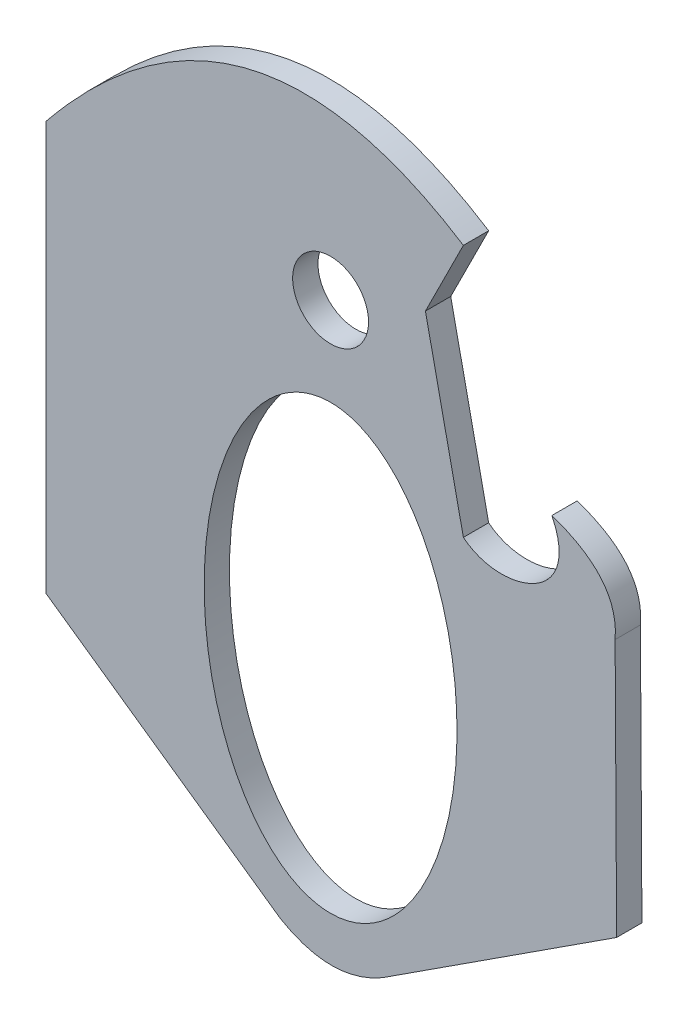
ISO-10303-21;
HEADER;
FILE_DESCRIPTION(('STEP AP214'),'2;1');
FILE_NAME('part.step','',(''),(''),'','','');
FILE_SCHEMA(('AUTOMOTIVE_DESIGN { 1 0 10303 214 1 1 1 1 }'));
ENDSEC;
DATA;
#1=APPLICATION_CONTEXT('core data for automotive mechanical design processes');
#2=APPLICATION_PROTOCOL_DEFINITION('international standard','automotive_design',2000,#1);
#3=PRODUCT_CONTEXT('',#1,'mechanical');
#4=PRODUCT('Part','Part','',(#3));
#5=PRODUCT_RELATED_PRODUCT_CATEGORY('part','',(#4));
#6=PRODUCT_DEFINITION_FORMATION('','',#4);
#7=PRODUCT_DEFINITION_CONTEXT('part definition',#1,'design');
#8=PRODUCT_DEFINITION('design','',#6,#7);
#9=PRODUCT_DEFINITION_SHAPE('','',#8);
#10=(LENGTH_UNIT() NAMED_UNIT(*) SI_UNIT(.MILLI.,.METRE.));
#11=(NAMED_UNIT(*) PLANE_ANGLE_UNIT() SI_UNIT($,.RADIAN.));
#12=(NAMED_UNIT(*) SI_UNIT($,.STERADIAN.) SOLID_ANGLE_UNIT());
#13=UNCERTAINTY_MEASURE_WITH_UNIT(LENGTH_MEASURE(1.E-05),#10,'distance_accuracy_value','');
#14=(GEOMETRIC_REPRESENTATION_CONTEXT(3) GLOBAL_UNCERTAINTY_ASSIGNED_CONTEXT((#13)) GLOBAL_UNIT_ASSIGNED_CONTEXT((#10,
#11,#12)) REPRESENTATION_CONTEXT('',''));
#15=CARTESIAN_POINT('',(0.,0.,0.));
#16=DIRECTION('',(0.,0.,1.));
#17=DIRECTION('',(1.,0.,0.));
#18=AXIS2_PLACEMENT_3D('',#15,#16,#17);
#19=CARTESIAN_POINT('',(10.5,33.5,2.));
#20=CARTESIAN_POINT('',(-6.9576145642611,44.6827292567089,2.));
#21=CARTESIAN_POINT('',(-22.5,25.5,2.));
#22=B_SPLINE_CURVE_WITH_KNOTS('',2,(#19,#20,#21),.UNSPECIFIED.,.F.,.F.,(3,3),(0.,1.),.UNSPECIFIED.);
#23=DIRECTION('',(0.,0.,-1.));
#24=VECTOR('',#23,1.);
#25=SURFACE_OF_LINEAR_EXTRUSION('',#22,#24);
#26=CARTESIAN_POINT('',(10.5,33.5,0.));
#27=CARTESIAN_POINT('',(-6.9576145642611,44.6827292567089,0.));
#28=CARTESIAN_POINT('',(-22.5,25.5,0.));
#29=B_SPLINE_CURVE_WITH_KNOTS('',2,(#26,#27,#28),.UNSPECIFIED.,.F.,.F.,(3,3),(0.,1.),.UNSPECIFIED.);
#30=CARTESIAN_POINT('',(10.5,33.5,0.));
#31=VERTEX_POINT('',#30);
#32=CARTESIAN_POINT('',(-22.5,25.5,0.));
#33=VERTEX_POINT('',#32);
#34=EDGE_CURVE('E142',#31,#33,#29,.T.);
#35=ORIENTED_EDGE('',*,*,#34,.T.);
#36=DIRECTION('',(0.,0.,-1.));
#37=VECTOR('',#36,1.);
#38=CARTESIAN_POINT('',(-22.5,25.5,2.));
#39=LINE('',#38,#37);
#40=CARTESIAN_POINT('',(-22.5,25.5,2.));
#41=VERTEX_POINT('',#40);
#42=EDGE_CURVE('E11',#41,#33,#39,.T.);
#43=ORIENTED_EDGE('',*,*,#42,.F.);
#44=CARTESIAN_POINT('',(10.5,33.5,2.));
#45=VERTEX_POINT('',#44);
#46=EDGE_CURVE('E181',#45,#41,#22,.T.);
#47=ORIENTED_EDGE('',*,*,#46,.F.);
#48=DIRECTION('',(0.,0.,-1.));
#49=VECTOR('',#48,1.);
#50=CARTESIAN_POINT('',(10.5,33.5,2.));
#51=LINE('',#50,#49);
#52=EDGE_CURVE('E135',#45,#31,#51,.T.);
#53=ORIENTED_EDGE('',*,*,#52,.T.);
#54=EDGE_LOOP('',(#35,#43,#47,#53));
#55=FACE_BOUND('',#54,.T.);
#56=ADVANCED_FACE('F30',(#55),#25,.F.);
#57=CARTESIAN_POINT('',(-22.5,-4.50010161055344,2.));
#58=DIRECTION('',(1.,0.,0.));
#59=DIRECTION('',(0.,0.,-1.));
#60=AXIS2_PLACEMENT_3D('',#57,#58,#59);
#61=PLANE('',#60);
#62=DIRECTION('',(0.,-1.,0.));
#63=VECTOR('',#62,1.);
#64=CARTESIAN_POINT('',(-22.5,-4.50010161055344,0.));
#65=LINE('',#64,#63);
#66=CARTESIAN_POINT('',(-22.5,-6.84577717850007,0.));
#67=VERTEX_POINT('',#66);
#68=EDGE_CURVE('E147',#33,#67,#65,.T.);
#69=ORIENTED_EDGE('',*,*,#68,.T.);
#70=DIRECTION('',(0.,0.,-1.));
#71=VECTOR('',#70,1.);
#72=CARTESIAN_POINT('',(-22.5,-6.84577717850007,2.));
#73=LINE('',#72,#71);
#74=CARTESIAN_POINT('',(-22.5,-6.84577717850007,2.));
#75=VERTEX_POINT('',#74);
#76=EDGE_CURVE('E39',#75,#67,#73,.T.);
#77=ORIENTED_EDGE('',*,*,#76,.F.);
#78=DIRECTION('',(0.,-1.,0.));
#79=VECTOR('',#78,1.);
#80=CARTESIAN_POINT('',(-22.5,25.5,2.));
#81=LINE('',#80,#79);
#82=EDGE_CURVE('E96',#41,#75,#81,.T.);
#83=ORIENTED_EDGE('',*,*,#82,.F.);
#84=ORIENTED_EDGE('',*,*,#42,.T.);
#85=EDGE_LOOP('',(#69,#77,#83,#84));
#86=FACE_BOUND('',#85,.T.);
#87=ADVANCED_FACE('F250',(#86),#61,.F.);
#88=CARTESIAN_POINT('',(-22.5,-6.84577717850007,2.));
#89=DIRECTION('',(0.57420529744295,0.818711351080742,0.));
#90=DIRECTION('',(-0.818711351080742,0.57420529744295,0.));
#91=AXIS2_PLACEMENT_3D('',#88,#89,#90);
#92=PLANE('',#91);
#93=DIRECTION('',(0.818711351080742,-0.57420529744295,0.));
#94=VECTOR('',#93,1.);
#95=CARTESIAN_POINT('',(-22.5,-6.84577717850007,0.));
#96=LINE('',#95,#94);
#97=CARTESIAN_POINT('',(-3.97051358736425,-19.8414798067678,0.));
#98=VERTEX_POINT('',#97);
#99=EDGE_CURVE('E153',#67,#98,#96,.T.);
#100=ORIENTED_EDGE('',*,*,#99,.T.);
#101=DIRECTION('',(0.,0.,-1.));
#102=VECTOR('',#101,1.);
#103=CARTESIAN_POINT('',(-3.97051358736425,-19.8414798067678,2.));
#104=LINE('',#103,#102);
#105=CARTESIAN_POINT('',(-3.97051358736425,-19.8414798067678,2.));
#106=VERTEX_POINT('',#105);
#107=EDGE_CURVE('E194',#106,#98,#104,.T.);
#108=ORIENTED_EDGE('',*,*,#107,.F.);
#109=DIRECTION('',(0.818711351080742,-0.57420529744295,0.));
#110=VECTOR('',#109,1.);
#111=CARTESIAN_POINT('',(-22.5,-6.84577717850007,2.));
#112=LINE('',#111,#110);
#113=EDGE_CURVE('E202',#75,#106,#112,.T.);
#114=ORIENTED_EDGE('',*,*,#113,.F.);
#115=ORIENTED_EDGE('',*,*,#76,.T.);
#116=EDGE_LOOP('',(#100,#108,#114,#115));
#117=FACE_BOUND('',#116,.T.);
#118=ADVANCED_FACE('F200',(#117),#92,.F.);
#119=CARTESIAN_POINT('',(-3.97051358736425,-19.8414798067678,2.));
#120=CARTESIAN_POINT('',(0.0710731877515081,-22.212443978777,2.));
#121=CARTESIAN_POINT('',(4.12041986000812,-19.8414798067678,2.));
#122=B_SPLINE_CURVE_WITH_KNOTS('',2,(#119,#120,#121),.UNSPECIFIED.,.F.,.F.,(3,3),(0.,1.),.UNSPECIFIED.);
#123=DIRECTION('',(0.,0.,-1.));
#124=VECTOR('',#123,1.);
#125=SURFACE_OF_LINEAR_EXTRUSION('',#122,#124);
#126=CARTESIAN_POINT('',(-3.97051358736425,-19.8414798067678,0.));
#127=CARTESIAN_POINT('',(0.0710731877515081,-22.212443978777,0.));
#128=CARTESIAN_POINT('',(4.12041986000812,-19.8414798067678,0.));
#129=B_SPLINE_CURVE_WITH_KNOTS('',2,(#126,#127,#128),.UNSPECIFIED.,.F.,.F.,(3,3),(0.,1.),.UNSPECIFIED.);
#130=CARTESIAN_POINT('',(4.12041986000812,-19.8414798067678,0.));
#131=VERTEX_POINT('',#130);
#132=EDGE_CURVE('E155',#98,#131,#129,.T.);
#133=ORIENTED_EDGE('',*,*,#132,.T.);
#134=DIRECTION('',(0.,0.,-1.));
#135=VECTOR('',#134,1.);
#136=CARTESIAN_POINT('',(4.12041986000812,-19.8414798067678,2.));
#137=LINE('',#136,#135);
#138=CARTESIAN_POINT('',(4.12041986000812,-19.8414798067678,2.));
#139=VERTEX_POINT('',#138);
#140=EDGE_CURVE('E191',#139,#131,#137,.T.);
#141=ORIENTED_EDGE('',*,*,#140,.F.);
#142=EDGE_CURVE('E220',#106,#139,#122,.T.);
#143=ORIENTED_EDGE('',*,*,#142,.F.);
#144=ORIENTED_EDGE('',*,*,#107,.T.);
#145=EDGE_LOOP('',(#133,#141,#143,#144));
#146=FACE_BOUND('',#145,.T.);
#147=ADVANCED_FACE('F211',(#146),#125,.F.);
#148=CARTESIAN_POINT('',(22.6204198600081,-7.84147980676779,2.));
#149=DIRECTION('',(-0.544191105099023,0.838961287027658,0.));
#150=DIRECTION('',(-0.838961287027658,-0.544191105099023,0.));
#151=AXIS2_PLACEMENT_3D('',#148,#149,#150);
#152=PLANE('',#151);
#153=DIRECTION('',(0.838961287027658,0.544191105099023,0.));
#154=VECTOR('',#153,1.);
#155=CARTESIAN_POINT('',(22.6204198600081,-7.84147980676779,0.));
#156=LINE('',#155,#154);
#157=CARTESIAN_POINT('',(22.6204198600081,-7.84147980676779,0.));
#158=VERTEX_POINT('',#157);
#159=EDGE_CURVE('E159',#131,#158,#156,.T.);
#160=ORIENTED_EDGE('',*,*,#159,.T.);
#161=DIRECTION('',(0.,0.,-1.));
#162=VECTOR('',#161,1.);
#163=CARTESIAN_POINT('',(22.6204198600081,-7.84147980676779,2.));
#164=LINE('',#163,#162);
#165=CARTESIAN_POINT('',(22.6204198600081,-7.84147980676779,2.));
#166=VERTEX_POINT('',#165);
#167=EDGE_CURVE('E188',#166,#158,#164,.T.);
#168=ORIENTED_EDGE('',*,*,#167,.F.);
#169=DIRECTION('',(0.838961287027658,0.544191105099023,0.));
#170=VECTOR('',#169,1.);
#171=CARTESIAN_POINT('',(22.6204198600081,-7.84147980676779,2.));
#172=LINE('',#171,#170);
#173=EDGE_CURVE('E217',#139,#166,#172,.T.);
#174=ORIENTED_EDGE('',*,*,#173,.F.);
#175=ORIENTED_EDGE('',*,*,#140,.T.);
#176=EDGE_LOOP('',(#160,#168,#174,#175));
#177=FACE_BOUND('',#176,.T.);
#178=ADVANCED_FACE('F215',(#177),#152,.F.);
#179=CARTESIAN_POINT('',(22.5,12.5,2.));
#180=DIRECTION('',(-0.999982477755434,-0.00591981267468138,0.));
#181=DIRECTION('',(0.00591981267468138,-0.999982477755434,0.));
#182=AXIS2_PLACEMENT_3D('',#179,#180,#181);
#183=PLANE('',#182);
#184=DIRECTION('',(-0.00591981267468138,0.999982477755434,0.));
#185=VECTOR('',#184,1.);
#186=CARTESIAN_POINT('',(22.5,12.5,0.));
#187=LINE('',#186,#185);
#188=CARTESIAN_POINT('',(22.5,12.5,0.));
#189=VERTEX_POINT('',#188);
#190=EDGE_CURVE('E164',#158,#189,#187,.T.);
#191=ORIENTED_EDGE('',*,*,#190,.T.);
#192=DIRECTION('',(0.,0.,-1.));
#193=VECTOR('',#192,1.);
#194=CARTESIAN_POINT('',(22.5,12.5,2.));
#195=LINE('',#194,#193);
#196=CARTESIAN_POINT('',(22.5,12.5,2.));
#197=VERTEX_POINT('',#196);
#198=EDGE_CURVE('E185',#197,#189,#195,.T.);
#199=ORIENTED_EDGE('',*,*,#198,.F.);
#200=DIRECTION('',(-0.00591981267468138,0.999982477755434,0.));
#201=VECTOR('',#200,1.);
#202=CARTESIAN_POINT('',(22.5,12.5,2.));
#203=LINE('',#202,#201);
#204=EDGE_CURVE('E219',#166,#197,#203,.T.);
#205=ORIENTED_EDGE('',*,*,#204,.F.);
#206=ORIENTED_EDGE('',*,*,#167,.T.);
#207=EDGE_LOOP('',(#191,#199,#205,#206));
#208=FACE_BOUND('',#207,.T.);
#209=ADVANCED_FACE('F239',(#208),#183,.F.);
#210=CARTESIAN_POINT('',(22.5,12.5,2.));
#211=CARTESIAN_POINT('',(22.8535533905932,16.6819805153394,2.));
#212=CARTESIAN_POINT('',(17.5,18.5,2.));
#213=B_SPLINE_CURVE_WITH_KNOTS('',2,(#210,#211,#212),.UNSPECIFIED.,.F.,.F.,(3,3),(0.,1.),.UNSPECIFIED.);
#214=DIRECTION('',(0.,0.,-1.));
#215=VECTOR('',#214,1.);
#216=SURFACE_OF_LINEAR_EXTRUSION('',#213,#215);
#217=CARTESIAN_POINT('',(22.5,12.5,0.));
#218=CARTESIAN_POINT('',(22.8535533905932,16.6819805153394,0.));
#219=CARTESIAN_POINT('',(17.5,18.5,0.));
#220=B_SPLINE_CURVE_WITH_KNOTS('',2,(#217,#218,#219),.UNSPECIFIED.,.F.,.F.,(3,3),(0.,1.),.UNSPECIFIED.);
#221=CARTESIAN_POINT('',(17.5,18.5,0.));
#222=VERTEX_POINT('',#221);
#223=EDGE_CURVE('E166',#189,#222,#220,.T.);
#224=ORIENTED_EDGE('',*,*,#223,.T.);
#225=DIRECTION('',(0.,0.,-1.));
#226=VECTOR('',#225,1.);
#227=CARTESIAN_POINT('',(17.5,18.5,2.));
#228=LINE('',#227,#226);
#229=CARTESIAN_POINT('',(17.5,18.5,2.));
#230=VERTEX_POINT('',#229);
#231=EDGE_CURVE('E130',#230,#222,#228,.T.);
#232=ORIENTED_EDGE('',*,*,#231,.F.);
#233=EDGE_CURVE('E121',#197,#230,#213,.T.);
#234=ORIENTED_EDGE('',*,*,#233,.F.);
#235=ORIENTED_EDGE('',*,*,#198,.T.);
#236=EDGE_LOOP('',(#224,#232,#234,#235));
#237=FACE_BOUND('',#236,.T.);
#238=ADVANCED_FACE('F235',(#237),#216,.F.);
#239=CARTESIAN_POINT('',(17.5,18.5,2.));
#240=CARTESIAN_POINT('',(20.037267900825,13.3063771075866,2.));
#241=CARTESIAN_POINT('',(13.496182411404,11.0275691706597,2.));
#242=CARTESIAN_POINT('',(10.5,13.5,2.));
#243=B_SPLINE_CURVE_WITH_KNOTS('',3,(#239,#240,#241,#242),.UNSPECIFIED.,.F.,.F.,(4,4),(0.,1.),.UNSPECIFIED.);
#244=DIRECTION('',(0.,0.,-1.));
#245=VECTOR('',#244,1.);
#246=SURFACE_OF_LINEAR_EXTRUSION('',#243,#245);
#247=CARTESIAN_POINT('',(17.5,18.5,0.));
#248=CARTESIAN_POINT('',(20.037267900825,13.3063771075866,0.));
#249=CARTESIAN_POINT('',(13.496182411404,11.0275691706597,0.));
#250=CARTESIAN_POINT('',(10.5,13.5,0.));
#251=B_SPLINE_CURVE_WITH_KNOTS('',3,(#247,#248,#249,#250),.UNSPECIFIED.,.F.,.F.,(4,4),(0.,1.),.UNSPECIFIED.);
#252=CARTESIAN_POINT('',(10.5,13.5,0.));
#253=VERTEX_POINT('',#252);
#254=EDGE_CURVE('E129',#222,#253,#251,.T.);
#255=ORIENTED_EDGE('',*,*,#254,.T.);
#256=DIRECTION('',(0.,0.,-1.));
#257=VECTOR('',#256,1.);
#258=CARTESIAN_POINT('',(10.5,13.5,2.));
#259=LINE('',#258,#257);
#260=CARTESIAN_POINT('',(10.5,13.5,2.));
#261=VERTEX_POINT('',#260);
#262=EDGE_CURVE('E126',#261,#253,#259,.T.);
#263=ORIENTED_EDGE('',*,*,#262,.F.);
#264=EDGE_CURVE('E115',#230,#261,#243,.T.);
#265=ORIENTED_EDGE('',*,*,#264,.F.);
#266=ORIENTED_EDGE('',*,*,#231,.T.);
#267=EDGE_LOOP('',(#255,#263,#265,#266));
#268=FACE_BOUND('',#267,.T.);
#269=ADVANCED_FACE('F127',(#268),#246,.F.);
#270=CARTESIAN_POINT('',(7.49999999999997,27.5,2.));
#271=DIRECTION('',(-0.97780241407741,-0.209529088730874,0.));
#272=DIRECTION('',(0.209529088730874,-0.97780241407741,0.));
#273=AXIS2_PLACEMENT_3D('',#270,#271,#272);
#274=PLANE('',#273);
#275=DIRECTION('',(-0.209529088730874,0.977802414077409,0.));
#276=VECTOR('',#275,1.);
#277=CARTESIAN_POINT('',(7.49999999999997,27.5,0.));
#278=LINE('',#277,#276);
#279=CARTESIAN_POINT('',(7.49999999999997,27.5,0.));
#280=VERTEX_POINT('',#279);
#281=EDGE_CURVE('E82',#253,#280,#278,.T.);
#282=ORIENTED_EDGE('',*,*,#281,.T.);
#283=DIRECTION('',(0.,0.,-1.));
#284=VECTOR('',#283,1.);
#285=CARTESIAN_POINT('',(7.49999999999997,27.5,2.));
#286=LINE('',#285,#284);
#287=CARTESIAN_POINT('',(7.49999999999997,27.5,2.));
#288=VERTEX_POINT('',#287);
#289=EDGE_CURVE('E131',#288,#280,#286,.T.);
#290=ORIENTED_EDGE('',*,*,#289,.F.);
#291=DIRECTION('',(-0.209529088730874,0.977802414077409,0.));
#292=VECTOR('',#291,1.);
#293=CARTESIAN_POINT('',(7.49999999999997,27.5,2.));
#294=LINE('',#293,#292);
#295=EDGE_CURVE('E119',#261,#288,#294,.T.);
#296=ORIENTED_EDGE('',*,*,#295,.F.);
#297=ORIENTED_EDGE('',*,*,#262,.T.);
#298=EDGE_LOOP('',(#282,#290,#296,#297));
#299=FACE_BOUND('',#298,.T.);
#300=ADVANCED_FACE('F133',(#299),#274,.F.);
#301=CARTESIAN_POINT('',(10.5,33.5,2.));
#302=DIRECTION('',(-0.894427190999916,0.447213595499957,0.));
#303=DIRECTION('',(-0.447213595499957,-0.894427190999916,0.));
#304=AXIS2_PLACEMENT_3D('',#301,#302,#303);
#305=PLANE('',#304);
#306=DIRECTION('',(0.447213595499957,0.894427190999916,0.));
#307=VECTOR('',#306,1.);
#308=CARTESIAN_POINT('',(10.5,33.5,0.));
#309=LINE('',#308,#307);
#310=EDGE_CURVE('E88',#280,#31,#309,.T.);
#311=ORIENTED_EDGE('',*,*,#310,.T.);
#312=ORIENTED_EDGE('',*,*,#52,.F.);
#313=DIRECTION('',(0.447213595499957,0.894427190999916,0.));
#314=VECTOR('',#313,1.);
#315=CARTESIAN_POINT('',(10.5,33.5,2.));
#316=LINE('',#315,#314);
#317=EDGE_CURVE('E47',#288,#45,#316,.T.);
#318=ORIENTED_EDGE('',*,*,#317,.F.);
#319=ORIENTED_EDGE('',*,*,#289,.T.);
#320=EDGE_LOOP('',(#311,#312,#318,#319));
#321=FACE_BOUND('',#320,.T.);
#322=ADVANCED_FACE('F260',(#321),#305,.F.);
#323=CARTESIAN_POINT('',(-6.47880728213057,37.0913646283544,2.));
#324=DIRECTION('',(0.,0.,1.));
#325=DIRECTION('',(1.,0.,0.));
#326=AXIS2_PLACEMENT_3D('',#323,#324,#325);
#327=PLANE('',#326);
#328=CARTESIAN_POINT('',(0.,0.,2.));
#329=DIRECTION('',(0.,0.,1.));
#330=DIRECTION('',(0.,-1.,0.));
#331=AXIS2_PLACEMENT_3D('',#328,#329,#330);
#332=ELLIPSE('',#331,17.5,10.);
#333=CARTESIAN_POINT('',(0.,-17.5,2.));
#334=VERTEX_POINT('',#333);
#335=EDGE_CURVE('E286',#334,#334,#332,.T.);
#336=ORIENTED_EDGE('',*,*,#335,.F.);
#337=EDGE_LOOP('',(#336));
#338=FACE_BOUND('',#337,.T.);
#339=CARTESIAN_POINT('',(0.,24.5,2.));
#340=DIRECTION('',(0.,0.,1.));
#341=DIRECTION('',(1.,0.,0.));
#342=AXIS2_PLACEMENT_3D('',#339,#340,#341);
#343=CIRCLE('',#342,3.);
#344=CARTESIAN_POINT('',(3.,24.5,2.));
#345=VERTEX_POINT('',#344);
#346=EDGE_CURVE('E285',#345,#345,#343,.T.);
#347=ORIENTED_EDGE('',*,*,#346,.F.);
#348=EDGE_LOOP('',(#347));
#349=FACE_BOUND('',#348,.T.);
#350=ORIENTED_EDGE('',*,*,#46,.T.);
#351=ORIENTED_EDGE('',*,*,#82,.T.);
#352=ORIENTED_EDGE('',*,*,#113,.T.);
#353=ORIENTED_EDGE('',*,*,#142,.T.);
#354=ORIENTED_EDGE('',*,*,#173,.T.);
#355=ORIENTED_EDGE('',*,*,#204,.T.);
#356=ORIENTED_EDGE('',*,*,#233,.T.);
#357=ORIENTED_EDGE('',*,*,#264,.T.);
#358=ORIENTED_EDGE('',*,*,#295,.T.);
#359=ORIENTED_EDGE('',*,*,#317,.T.);
#360=EDGE_LOOP('',(#350,#351,#352,#353,#354,#355,#356,#357,#358,#359));
#361=FACE_BOUND('',#360,.T.);
#362=ADVANCED_FACE('F117',(#338,#349,#361),#327,.T.);
#363=CARTESIAN_POINT('',(-6.47880728213057,37.0913646283544,0.));
#364=DIRECTION('',(0.,0.,1.));
#365=DIRECTION('',(1.,0.,0.));
#366=AXIS2_PLACEMENT_3D('',#363,#364,#365);
#367=PLANE('',#366);
#368=CARTESIAN_POINT('',(0.,0.,0.));
#369=DIRECTION('',(0.,0.,1.));
#370=DIRECTION('',(0.,-1.,0.));
#371=AXIS2_PLACEMENT_3D('',#368,#369,#370);
#372=ELLIPSE('',#371,17.5,10.);
#373=CARTESIAN_POINT('',(0.,-17.5,0.));
#374=VERTEX_POINT('',#373);
#375=EDGE_CURVE('E281',#374,#374,#372,.T.);
#376=ORIENTED_EDGE('',*,*,#375,.T.);
#377=EDGE_LOOP('',(#376));
#378=FACE_BOUND('',#377,.T.);
#379=CARTESIAN_POINT('',(0.,24.5,0.));
#380=DIRECTION('',(0.,0.,1.));
#381=DIRECTION('',(1.,0.,0.));
#382=AXIS2_PLACEMENT_3D('',#379,#380,#381);
#383=CIRCLE('',#382,3.);
#384=CARTESIAN_POINT('',(3.,24.5,0.));
#385=VERTEX_POINT('',#384);
#386=EDGE_CURVE('E148',#385,#385,#383,.T.);
#387=ORIENTED_EDGE('',*,*,#386,.T.);
#388=EDGE_LOOP('',(#387));
#389=FACE_BOUND('',#388,.T.);
#390=ORIENTED_EDGE('',*,*,#34,.F.);
#391=ORIENTED_EDGE('',*,*,#310,.F.);
#392=ORIENTED_EDGE('',*,*,#281,.F.);
#393=ORIENTED_EDGE('',*,*,#254,.F.);
#394=ORIENTED_EDGE('',*,*,#223,.F.);
#395=ORIENTED_EDGE('',*,*,#190,.F.);
#396=ORIENTED_EDGE('',*,*,#159,.F.);
#397=ORIENTED_EDGE('',*,*,#132,.F.);
#398=ORIENTED_EDGE('',*,*,#99,.F.);
#399=ORIENTED_EDGE('',*,*,#68,.F.);
#400=EDGE_LOOP('',(#390,#391,#392,#393,#394,#395,#396,#397,#398,#399));
#401=FACE_BOUND('',#400,.T.);
#402=ADVANCED_FACE('F206',(#378,#389,#401),#367,.F.);
#403=CARTESIAN_POINT('',(0.,24.5,0.));
#404=DIRECTION('',(0.,0.,1.));
#405=DIRECTION('',(1.,0.,0.));
#406=AXIS2_PLACEMENT_3D('',#403,#404,#405);
#407=CYLINDRICAL_SURFACE('',#406,3.);
#408=ORIENTED_EDGE('',*,*,#386,.F.);
#409=EDGE_LOOP('',(#408));
#410=FACE_BOUND('',#409,.T.);
#411=ORIENTED_EDGE('',*,*,#346,.T.);
#412=EDGE_LOOP('',(#411));
#413=FACE_BOUND('',#412,.T.);
#414=ADVANCED_FACE('F271',(#410,#413),#407,.F.);
#415=DIRECTION('',(0.,0.,1.));
#416=VECTOR('',#415,1.);
#417=SURFACE_OF_LINEAR_EXTRUSION('',#372,#416);
#418=ORIENTED_EDGE('',*,*,#375,.F.);
#419=EDGE_LOOP('',(#418));
#420=FACE_BOUND('',#419,.T.);
#421=ORIENTED_EDGE('',*,*,#335,.T.);
#422=EDGE_LOOP('',(#421));
#423=FACE_BOUND('',#422,.T.);
#424=ADVANCED_FACE('F276',(#420,#423),#417,.F.);
#425=CLOSED_SHELL('',(#56,#87,#118,#147,#178,#209,#238,#269,#300,#322,#362,#402,#414,#424));
#426=MANIFOLD_SOLID_BREP('B2',#425);
#427=ADVANCED_BREP_SHAPE_REPRESENTATION('',(#18,#426),#14);
#428=SHAPE_DEFINITION_REPRESENTATION(#9,#427);
ENDSEC;
END-ISO-10303-21;
